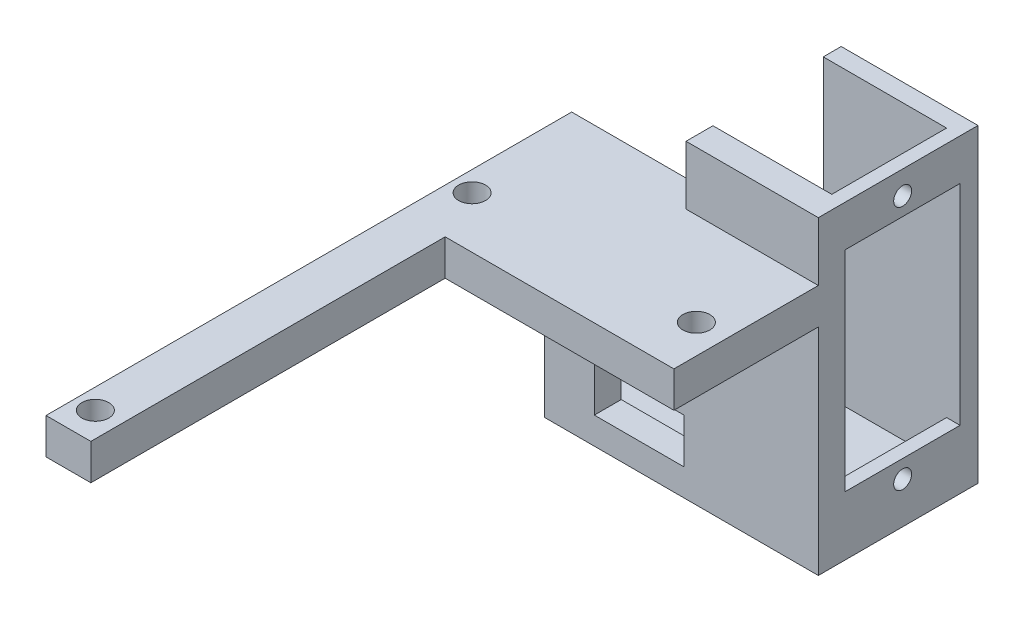
ISO-10303-21;
HEADER;
FILE_DESCRIPTION(('STEP AP214'),'2;1');
FILE_NAME('part.step','',(''),(''),'','','');
FILE_SCHEMA(('AUTOMOTIVE_DESIGN { 1 0 10303 214 1 1 1 1 }'));
ENDSEC;
DATA;
#1=APPLICATION_CONTEXT('core data for automotive mechanical design processes');
#2=APPLICATION_PROTOCOL_DEFINITION('international standard','automotive_design',2000,#1);
#3=PRODUCT_CONTEXT('',#1,'mechanical');
#4=PRODUCT('Part','Part','',(#3));
#5=PRODUCT_RELATED_PRODUCT_CATEGORY('part','',(#4));
#6=PRODUCT_DEFINITION_FORMATION('','',#4);
#7=PRODUCT_DEFINITION_CONTEXT('part definition',#1,'design');
#8=PRODUCT_DEFINITION('design','',#6,#7);
#9=PRODUCT_DEFINITION_SHAPE('','',#8);
#10=(LENGTH_UNIT() NAMED_UNIT(*) SI_UNIT(.MILLI.,.METRE.));
#11=(NAMED_UNIT(*) PLANE_ANGLE_UNIT() SI_UNIT($,.RADIAN.));
#12=(NAMED_UNIT(*) SI_UNIT($,.STERADIAN.) SOLID_ANGLE_UNIT());
#13=UNCERTAINTY_MEASURE_WITH_UNIT(LENGTH_MEASURE(1.E-05),#10,'distance_accuracy_value','');
#14=(GEOMETRIC_REPRESENTATION_CONTEXT(3) GLOBAL_UNCERTAINTY_ASSIGNED_CONTEXT((#13)) GLOBAL_UNIT_ASSIGNED_CONTEXT((#10,
#11,#12)) REPRESENTATION_CONTEXT('',''));
#15=CARTESIAN_POINT('',(0.,0.,0.));
#16=DIRECTION('',(0.,0.,1.));
#17=DIRECTION('',(1.,0.,0.));
#18=AXIS2_PLACEMENT_3D('',#15,#16,#17);
#19=CARTESIAN_POINT('',(0.,4.,0.));
#20=DIRECTION('',(0.,1.,0.));
#21=DIRECTION('',(0.,0.,1.));
#22=AXIS2_PLACEMENT_3D('',#19,#20,#21);
#23=PLANE('',#22);
#24=CARTESIAN_POINT('',(-38.984375,4.,29.3515625));
#25=DIRECTION('',(0.,1.,0.));
#26=DIRECTION('',(0.,0.,1.));
#27=AXIS2_PLACEMENT_3D('',#24,#25,#26);
#28=CIRCLE('',#27,1.5);
#29=CARTESIAN_POINT('',(-38.984375,4.,30.8515625));
#30=VERTEX_POINT('',#29);
#31=EDGE_CURVE('E476',#30,#30,#28,.T.);
#32=ORIENTED_EDGE('',*,*,#31,.F.);
#33=EDGE_LOOP('',(#32));
#34=FACE_BOUND('',#33,.T.);
#35=CARTESIAN_POINT('',(-38.984375,4.,-12.6484375));
#36=DIRECTION('',(0.,1.,0.));
#37=DIRECTION('',(0.,0.,1.));
#38=AXIS2_PLACEMENT_3D('',#35,#36,#37);
#39=CIRCLE('',#38,1.5);
#40=CARTESIAN_POINT('',(-38.984375,4.,-11.1484375));
#41=VERTEX_POINT('',#40);
#42=EDGE_CURVE('E484',#41,#41,#39,.T.);
#43=ORIENTED_EDGE('',*,*,#42,.F.);
#44=EDGE_LOOP('',(#43));
#45=FACE_BOUND('',#44,.T.);
#46=CARTESIAN_POINT('',(-13.984375,4.,-12.6484375));
#47=DIRECTION('',(0.,1.,0.));
#48=DIRECTION('',(0.,0.,1.));
#49=AXIS2_PLACEMENT_3D('',#46,#47,#48);
#50=CIRCLE('',#49,1.5);
#51=CARTESIAN_POINT('',(-13.984375,4.,-11.1484375));
#52=VERTEX_POINT('',#51);
#53=EDGE_CURVE('E470',#52,#52,#50,.T.);
#54=ORIENTED_EDGE('',*,*,#53,.F.);
#55=EDGE_LOOP('',(#54));
#56=FACE_BOUND('',#55,.T.);
#57=DIRECTION('',(-1.,0.,0.));
#58=VECTOR('',#57,1.);
#59=CARTESIAN_POINT('',(-10.734375,4.,-22.9984375));
#60=LINE('',#59,#58);
#61=CARTESIAN_POINT('',(-10.734375,4.,-22.9984375));
#62=VERTEX_POINT('',#61);
#63=CARTESIAN_POINT('',(-25.484375,4.,-22.9984375));
#64=VERTEX_POINT('',#63);
#65=EDGE_CURVE('E85',#62,#64,#60,.T.);
#66=ORIENTED_EDGE('',*,*,#65,.T.);
#67=DIRECTION('',(0.,0.,1.));
#68=VECTOR('',#67,1.);
#69=CARTESIAN_POINT('',(-25.484375,4.,-25.9984375));
#70=LINE('',#69,#68);
#71=CARTESIAN_POINT('',(-25.484375,4.,-25.9984375));
#72=VERTEX_POINT('',#71);
#73=EDGE_CURVE('E262',#72,#64,#70,.T.);
#74=ORIENTED_EDGE('',*,*,#73,.F.);
#75=DIRECTION('',(1.,0.,0.));
#76=VECTOR('',#75,1.);
#77=CARTESIAN_POINT('',(-41.234375,4.,-25.9984375));
#78=LINE('',#77,#76);
#79=CARTESIAN_POINT('',(-41.234375,4.,-25.9984375));
#80=VERTEX_POINT('',#79);
#81=EDGE_CURVE('E466',#80,#72,#78,.T.);
#82=ORIENTED_EDGE('',*,*,#81,.F.);
#83=DIRECTION('',(0.,0.,1.));
#84=VECTOR('',#83,1.);
#85=CARTESIAN_POINT('',(-41.234375,4.,-20.8984375));
#86=LINE('',#85,#84);
#87=CARTESIAN_POINT('',(-41.234375,4.,32.6015625));
#88=VERTEX_POINT('',#87);
#89=EDGE_CURVE('E521',#80,#88,#86,.T.);
#90=ORIENTED_EDGE('',*,*,#89,.T.);
#91=DIRECTION('',(1.,0.,0.));
#92=VECTOR('',#91,1.);
#93=CARTESIAN_POINT('',(-41.234375,4.,32.6015625));
#94=LINE('',#93,#92);
#95=CARTESIAN_POINT('',(-36.234375,4.,32.6015625));
#96=VERTEX_POINT('',#95);
#97=EDGE_CURVE('E513',#88,#96,#94,.T.);
#98=ORIENTED_EDGE('',*,*,#97,.T.);
#99=DIRECTION('',(0.,0.,1.));
#100=VECTOR('',#99,1.);
#101=CARTESIAN_POINT('',(-36.234375,4.,-20.8984375));
#102=LINE('',#101,#100);
#103=CARTESIAN_POINT('',(-36.234375,4.,-6.8984375));
#104=VERTEX_POINT('',#103);
#105=EDGE_CURVE('E517',#104,#96,#102,.T.);
#106=ORIENTED_EDGE('',*,*,#105,.F.);
#107=DIRECTION('',(1.,0.,0.));
#108=VECTOR('',#107,1.);
#109=CARTESIAN_POINT('',(0.,4.,-6.8984375));
#110=LINE('',#109,#108);
#111=CARTESIAN_POINT('',(-10.734375,4.,-6.8984375));
#112=VERTEX_POINT('',#111);
#113=EDGE_CURVE('E498',#104,#112,#110,.T.);
#114=ORIENTED_EDGE('',*,*,#113,.T.);
#115=DIRECTION('',(0.,0.,1.));
#116=VECTOR('',#115,1.);
#117=CARTESIAN_POINT('',(-10.734375,4.,0.));
#118=LINE('',#117,#116);
#119=EDGE_CURVE('E495',#62,#112,#118,.T.);
#120=ORIENTED_EDGE('',*,*,#119,.F.);
#121=EDGE_LOOP('',(#66,#74,#82,#90,#98,#106,#114,#120));
#122=FACE_BOUND('',#121,.T.);
#123=ADVANCED_FACE('F67',(#34,#45,#56,#122),#23,.T.);
#124=CARTESIAN_POINT('',(0.,-5.2,0.));
#125=DIRECTION('',(0.,1.,0.));
#126=DIRECTION('',(0.,0.,1.));
#127=AXIS2_PLACEMENT_3D('',#124,#125,#126);
#128=PLANE('',#127);
#129=DIRECTION('',(1.,0.,0.));
#130=VECTOR('',#129,1.);
#131=CARTESIAN_POINT('',(-41.234375,-5.2,-38.7984375));
#132=LINE('',#131,#130);
#133=CARTESIAN_POINT('',(-41.234375,-5.2,-38.7984375));
#134=VERTEX_POINT('',#133);
#135=CARTESIAN_POINT('',(-25.984375,-5.2,-38.7984375));
#136=VERTEX_POINT('',#135);
#137=EDGE_CURVE('E404',#134,#136,#132,.T.);
#138=ORIENTED_EDGE('',*,*,#137,.T.);
#139=DIRECTION('',(0.,0.,1.));
#140=VECTOR('',#139,1.);
#141=CARTESIAN_POINT('',(-25.984375,-5.2,-40.7984375));
#142=LINE('',#141,#140);
#143=CARTESIAN_POINT('',(-25.984375,-5.2,-40.7984375));
#144=VERTEX_POINT('',#143);
#145=EDGE_CURVE('E248',#144,#136,#142,.T.);
#146=ORIENTED_EDGE('',*,*,#145,.F.);
#147=DIRECTION('',(-1.,0.,0.));
#148=VECTOR('',#147,1.);
#149=CARTESIAN_POINT('',(-41.234375,-5.2,-40.7984375));
#150=LINE('',#149,#148);
#151=CARTESIAN_POINT('',(-41.234375,-5.2,-40.7984375));
#152=VERTEX_POINT('',#151);
#153=EDGE_CURVE('E407',#144,#152,#150,.T.);
#154=ORIENTED_EDGE('',*,*,#153,.T.);
#155=DIRECTION('',(0.,0.,1.));
#156=VECTOR('',#155,1.);
#157=CARTESIAN_POINT('',(-41.234375,-5.2,-40.7984375));
#158=LINE('',#157,#156);
#159=EDGE_CURVE('E400',#152,#134,#158,.T.);
#160=ORIENTED_EDGE('',*,*,#159,.T.);
#161=EDGE_LOOP('',(#138,#146,#154,#160));
#162=FACE_BOUND('',#161,.T.);
#163=ADVANCED_FACE('F563',(#162),#128,.T.);
#164=CARTESIAN_POINT('',(-10.734375,-22.,-40.7984375));
#165=DIRECTION('',(0.,1.,0.));
#166=DIRECTION('',(0.,0.,1.));
#167=AXIS2_PLACEMENT_3D('',#164,#165,#166);
#168=PLANE('',#167);
#169=DIRECTION('',(-1.,0.,0.));
#170=VECTOR('',#169,1.);
#171=CARTESIAN_POINT('',(-10.734375,-22.,-25.9984375));
#172=LINE('',#171,#170);
#173=CARTESIAN_POINT('',(-12.234375,-22.,-25.9984375));
#174=VERTEX_POINT('',#173);
#175=CARTESIAN_POINT('',(-41.234375,-22.,-25.9984375));
#176=VERTEX_POINT('',#175);
#177=EDGE_CURVE('E420',#174,#176,#172,.T.);
#178=ORIENTED_EDGE('',*,*,#177,.F.);
#179=DIRECTION('',(0.,0.,1.));
#180=VECTOR('',#179,1.);
#181=CARTESIAN_POINT('',(-12.234375,-22.,-25.9984375));
#182=LINE('',#181,#180);
#183=CARTESIAN_POINT('',(-12.234375,-22.,-38.7984375));
#184=VERTEX_POINT('',#183);
#185=EDGE_CURVE('E376',#184,#174,#182,.T.);
#186=ORIENTED_EDGE('',*,*,#185,.F.);
#187=DIRECTION('',(1.,0.,0.));
#188=VECTOR('',#187,1.);
#189=CARTESIAN_POINT('',(-41.234375,-22.,-38.7984375));
#190=LINE('',#189,#188);
#191=CARTESIAN_POINT('',(-41.234375,-22.,-38.7984375));
#192=VERTEX_POINT('',#191);
#193=EDGE_CURVE('E399',#192,#184,#190,.T.);
#194=ORIENTED_EDGE('',*,*,#193,.F.);
#195=DIRECTION('',(0.,0.,1.));
#196=VECTOR('',#195,1.);
#197=CARTESIAN_POINT('',(-41.234375,-22.,-40.7984375));
#198=LINE('',#197,#196);
#199=EDGE_CURVE('E431',#192,#176,#198,.T.);
#200=ORIENTED_EDGE('',*,*,#199,.T.);
#201=EDGE_LOOP('',(#178,#186,#194,#200));
#202=FACE_BOUND('',#201,.T.);
#203=ADVANCED_FACE('F569',(#202),#168,.T.);
#204=CARTESIAN_POINT('',(0.,0.,-25.9984375));
#205=DIRECTION('',(0.,0.,-1.));
#206=DIRECTION('',(-1.,0.,0.));
#207=AXIS2_PLACEMENT_3D('',#204,#205,#206);
#208=PLANE('',#207);
#209=DIRECTION('',(0.,-1.,0.));
#210=VECTOR('',#209,1.);
#211=CARTESIAN_POINT('',(-35.7067529166508,-16.,-25.9984375));
#212=LINE('',#211,#210);
#213=CARTESIAN_POINT('',(-35.7067529166508,-16.,-25.9984375));
#214=VERTEX_POINT('',#213);
#215=CARTESIAN_POINT('',(-35.7067529166508,-21.,-25.9984375));
#216=VERTEX_POINT('',#215);
#217=EDGE_CURVE('E314',#214,#216,#212,.T.);
#218=ORIENTED_EDGE('',*,*,#217,.T.);
#219=DIRECTION('',(1.,0.,0.));
#220=VECTOR('',#219,1.);
#221=CARTESIAN_POINT('',(-35.7067529166508,-21.,-25.9984375));
#222=LINE('',#221,#220);
#223=CARTESIAN_POINT('',(-25.7067529166508,-21.,-25.9984375));
#224=VERTEX_POINT('',#223);
#225=EDGE_CURVE('E318',#216,#224,#222,.T.);
#226=ORIENTED_EDGE('',*,*,#225,.T.);
#227=DIRECTION('',(0.,1.,0.));
#228=VECTOR('',#227,1.);
#229=CARTESIAN_POINT('',(-25.7067529166508,-16.,-25.9984375));
#230=LINE('',#229,#228);
#231=CARTESIAN_POINT('',(-25.7067529166508,-16.,-25.9984375));
#232=VERTEX_POINT('',#231);
#233=EDGE_CURVE('E93',#224,#232,#230,.T.);
#234=ORIENTED_EDGE('',*,*,#233,.T.);
#235=DIRECTION('',(-1.,0.,0.));
#236=VECTOR('',#235,1.);
#237=CARTESIAN_POINT('',(-35.7067529166508,-16.,-25.9984375));
#238=LINE('',#237,#236);
#239=EDGE_CURVE('E325',#232,#214,#238,.T.);
#240=ORIENTED_EDGE('',*,*,#239,.T.);
#241=EDGE_LOOP('',(#218,#226,#234,#240));
#242=FACE_BOUND('',#241,.T.);
#243=DIRECTION('',(1.,0.,0.));
#244=VECTOR('',#243,1.);
#245=CARTESIAN_POINT('',(-10.734375,-17.4,-25.9984375));
#246=LINE('',#245,#244);
#247=CARTESIAN_POINT('',(-12.234375,-17.4,-25.9984375));
#248=VERTEX_POINT('',#247);
#249=CARTESIAN_POINT('',(-10.734375,-17.4,-25.9984375));
#250=VERTEX_POINT('',#249);
#251=EDGE_CURVE('E387',#248,#250,#246,.T.);
#252=ORIENTED_EDGE('',*,*,#251,.F.);
#253=DIRECTION('',(0.,-1.,0.));
#254=VECTOR('',#253,1.);
#255=CARTESIAN_POINT('',(-12.234375,-17.4,-25.9984375));
#256=LINE('',#255,#254);
#257=EDGE_CURVE('E390',#248,#174,#256,.T.);
#258=ORIENTED_EDGE('',*,*,#257,.T.);
#259=ORIENTED_EDGE('',*,*,#177,.T.);
#260=DIRECTION('',(0.,1.,0.));
#261=VECTOR('',#260,1.);
#262=CARTESIAN_POINT('',(-41.234375,0.,-25.9984375));
#263=LINE('',#262,#261);
#264=EDGE_CURVE('E463',#176,#80,#263,.T.);
#265=ORIENTED_EDGE('',*,*,#264,.T.);
#266=ORIENTED_EDGE('',*,*,#81,.T.);
#267=DIRECTION('',(0.,-1.,0.));
#268=VECTOR('',#267,1.);
#269=CARTESIAN_POINT('',(-25.484375,10.55,-25.9984375));
#270=LINE('',#269,#268);
#271=CARTESIAN_POINT('',(-25.484375,10.55,-25.9984375));
#272=VERTEX_POINT('',#271);
#273=EDGE_CURVE('E274',#272,#72,#270,.T.);
#274=ORIENTED_EDGE('',*,*,#273,.F.);
#275=DIRECTION('',(-1.,0.,0.));
#276=VECTOR('',#275,1.);
#277=CARTESIAN_POINT('',(-10.734375,10.55,-25.9984375));
#278=LINE('',#277,#276);
#279=CARTESIAN_POINT('',(-12.234375,10.55,-25.9984375));
#280=VERTEX_POINT('',#279);
#281=EDGE_CURVE('E255',#280,#272,#278,.T.);
#282=ORIENTED_EDGE('',*,*,#281,.F.);
#283=DIRECTION('',(0.,1.,0.));
#284=VECTOR('',#283,1.);
#285=CARTESIAN_POINT('',(-12.234375,5.95,-25.9984375));
#286=LINE('',#285,#284);
#287=CARTESIAN_POINT('',(-12.234375,5.95,-25.9984375));
#288=VERTEX_POINT('',#287);
#289=EDGE_CURVE('E306',#288,#280,#286,.T.);
#290=ORIENTED_EDGE('',*,*,#289,.F.);
#291=DIRECTION('',(1.,0.,0.));
#292=VECTOR('',#291,1.);
#293=CARTESIAN_POINT('',(-10.734375,5.95,-25.9984375));
#294=LINE('',#293,#292);
#295=CARTESIAN_POINT('',(-10.734375,5.95,-25.9984375));
#296=VERTEX_POINT('',#295);
#297=EDGE_CURVE('E286',#288,#296,#294,.T.);
#298=ORIENTED_EDGE('',*,*,#297,.T.);
#299=DIRECTION('',(0.,-1.,0.));
#300=VECTOR('',#299,1.);
#301=CARTESIAN_POINT('',(-10.734375,4.,-25.9984375));
#302=LINE('',#301,#300);
#303=EDGE_CURVE('E459',#296,#250,#302,.T.);
#304=ORIENTED_EDGE('',*,*,#303,.T.);
#305=EDGE_LOOP('',(#252,#258,#259,#265,#266,#274,#282,#290,#298,#304));
#306=FACE_BOUND('',#305,.T.);
#307=ADVANCED_FACE('F618',(#242,#306),#208,.T.);
#308=CARTESIAN_POINT('',(-41.234375,-5.2,-38.7984375));
#309=DIRECTION('',(0.,0.,-1.));
#310=DIRECTION('',(-1.,0.,0.));
#311=AXIS2_PLACEMENT_3D('',#308,#309,#310);
#312=PLANE('',#311);
#313=DIRECTION('',(-1.,0.,0.));
#314=VECTOR('',#313,1.);
#315=CARTESIAN_POINT('',(-10.734375,5.95,-38.7984375));
#316=LINE('',#315,#314);
#317=CARTESIAN_POINT('',(-10.734375,5.95,-38.7984375));
#318=VERTEX_POINT('',#317);
#319=CARTESIAN_POINT('',(-12.234375,5.95,-38.7984375));
#320=VERTEX_POINT('',#319);
#321=EDGE_CURVE('E295',#318,#320,#316,.T.);
#322=ORIENTED_EDGE('',*,*,#321,.T.);
#323=DIRECTION('',(0.,1.,0.));
#324=VECTOR('',#323,1.);
#325=CARTESIAN_POINT('',(-12.234375,5.95,-38.7984375));
#326=LINE('',#325,#324);
#327=CARTESIAN_POINT('',(-12.234375,10.55,-38.7984375));
#328=VERTEX_POINT('',#327);
#329=EDGE_CURVE('E299',#320,#328,#326,.T.);
#330=ORIENTED_EDGE('',*,*,#329,.T.);
#331=DIRECTION('',(1.,0.,0.));
#332=VECTOR('',#331,1.);
#333=CARTESIAN_POINT('',(-10.734375,10.55,-38.7984375));
#334=LINE('',#333,#332);
#335=CARTESIAN_POINT('',(-25.984375,10.55,-38.7984375));
#336=VERTEX_POINT('',#335);
#337=EDGE_CURVE('E361',#336,#328,#334,.T.);
#338=ORIENTED_EDGE('',*,*,#337,.F.);
#339=DIRECTION('',(0.,-1.,0.));
#340=VECTOR('',#339,1.);
#341=CARTESIAN_POINT('',(-25.984375,10.55,-38.7984375));
#342=LINE('',#341,#340);
#343=EDGE_CURVE('E365',#336,#136,#342,.T.);
#344=ORIENTED_EDGE('',*,*,#343,.T.);
#345=ORIENTED_EDGE('',*,*,#137,.F.);
#346=DIRECTION('',(0.,-1.,0.));
#347=VECTOR('',#346,1.);
#348=CARTESIAN_POINT('',(-41.234375,-5.2,-38.7984375));
#349=LINE('',#348,#347);
#350=EDGE_CURVE('E416',#134,#192,#349,.T.);
#351=ORIENTED_EDGE('',*,*,#350,.T.);
#352=ORIENTED_EDGE('',*,*,#193,.T.);
#353=DIRECTION('',(0.,-1.,0.));
#354=VECTOR('',#353,1.);
#355=CARTESIAN_POINT('',(-12.234375,-17.4,-38.7984375));
#356=LINE('',#355,#354);
#357=CARTESIAN_POINT('',(-12.234375,-17.4,-38.7984375));
#358=VERTEX_POINT('',#357);
#359=EDGE_CURVE('E396',#358,#184,#356,.T.);
#360=ORIENTED_EDGE('',*,*,#359,.F.);
#361=DIRECTION('',(-1.,0.,0.));
#362=VECTOR('',#361,1.);
#363=CARTESIAN_POINT('',(-10.734375,-17.4,-38.7984375));
#364=LINE('',#363,#362);
#365=CARTESIAN_POINT('',(-10.734375,-17.4,-38.7984375));
#366=VERTEX_POINT('',#365);
#367=EDGE_CURVE('E381',#366,#358,#364,.T.);
#368=ORIENTED_EDGE('',*,*,#367,.F.);
#369=DIRECTION('',(0.,-1.,0.));
#370=VECTOR('',#369,1.);
#371=CARTESIAN_POINT('',(-10.734375,-5.2,-38.7984375));
#372=LINE('',#371,#370);
#373=EDGE_CURVE('E410',#318,#366,#372,.T.);
#374=ORIENTED_EDGE('',*,*,#373,.F.);
#375=EDGE_LOOP('',(#322,#330,#338,#344,#345,#351,#352,#360,#368,#374));
#376=FACE_BOUND('',#375,.T.);
#377=ADVANCED_FACE('F581',(#376),#312,.F.);
#378=CARTESIAN_POINT('',(0.,0.,0.));
#379=DIRECTION('',(0.,1.,0.));
#380=DIRECTION('',(0.,0.,1.));
#381=AXIS2_PLACEMENT_3D('',#378,#379,#380);
#382=PLANE('',#381);
#383=CARTESIAN_POINT('',(-13.984375,0.,-12.6484375));
#384=DIRECTION('',(0.,1.,0.));
#385=DIRECTION('',(0.,0.,1.));
#386=AXIS2_PLACEMENT_3D('',#383,#384,#385);
#387=CIRCLE('',#386,1.5);
#388=CARTESIAN_POINT('',(-13.984375,0.,-11.1484375));
#389=VERTEX_POINT('',#388);
#390=EDGE_CURVE('E488',#389,#389,#387,.T.);
#391=ORIENTED_EDGE('',*,*,#390,.T.);
#392=EDGE_LOOP('',(#391));
#393=FACE_BOUND('',#392,.T.);
#394=CARTESIAN_POINT('',(-38.984375,0.,-12.6484375));
#395=DIRECTION('',(0.,1.,0.));
#396=DIRECTION('',(0.,0.,1.));
#397=AXIS2_PLACEMENT_3D('',#394,#395,#396);
#398=CIRCLE('',#397,1.5);
#399=CARTESIAN_POINT('',(-38.984375,0.,-11.1484375));
#400=VERTEX_POINT('',#399);
#401=EDGE_CURVE('E480',#400,#400,#398,.T.);
#402=ORIENTED_EDGE('',*,*,#401,.T.);
#403=EDGE_LOOP('',(#402));
#404=FACE_BOUND('',#403,.T.);
#405=CARTESIAN_POINT('',(-38.984375,0.,29.3515625));
#406=DIRECTION('',(0.,1.,0.));
#407=DIRECTION('',(0.,0.,1.));
#408=AXIS2_PLACEMENT_3D('',#405,#406,#407);
#409=CIRCLE('',#408,1.5);
#410=CARTESIAN_POINT('',(-38.984375,0.,30.8515625));
#411=VERTEX_POINT('',#410);
#412=EDGE_CURVE('E471',#411,#411,#409,.T.);
#413=ORIENTED_EDGE('',*,*,#412,.T.);
#414=EDGE_LOOP('',(#413));
#415=FACE_BOUND('',#414,.T.);
#416=DIRECTION('',(-1.,0.,0.));
#417=VECTOR('',#416,1.);
#418=CARTESIAN_POINT('',(-10.734375,0.,-22.9984375));
#419=LINE('',#418,#417);
#420=CARTESIAN_POINT('',(-10.734375,0.,-22.9984375));
#421=VERTEX_POINT('',#420);
#422=CARTESIAN_POINT('',(-41.234375,0.,-22.9984375));
#423=VERTEX_POINT('',#422);
#424=EDGE_CURVE('E437',#421,#423,#419,.T.);
#425=ORIENTED_EDGE('',*,*,#424,.F.);
#426=DIRECTION('',(0.,0.,1.));
#427=VECTOR('',#426,1.);
#428=CARTESIAN_POINT('',(-10.734375,0.,0.));
#429=LINE('',#428,#427);
#430=CARTESIAN_POINT('',(-10.734375,0.,-6.8984375));
#431=VERTEX_POINT('',#430);
#432=EDGE_CURVE('E503',#421,#431,#429,.T.);
#433=ORIENTED_EDGE('',*,*,#432,.T.);
#434=DIRECTION('',(1.,0.,0.));
#435=VECTOR('',#434,1.);
#436=CARTESIAN_POINT('',(0.,0.,-6.8984375));
#437=LINE('',#436,#435);
#438=CARTESIAN_POINT('',(-36.234375,0.,-6.8984375));
#439=VERTEX_POINT('',#438);
#440=EDGE_CURVE('E499',#439,#431,#437,.T.);
#441=ORIENTED_EDGE('',*,*,#440,.F.);
#442=DIRECTION('',(0.,0.,1.));
#443=VECTOR('',#442,1.);
#444=CARTESIAN_POINT('',(-36.234375,0.,-20.8984375));
#445=LINE('',#444,#443);
#446=CARTESIAN_POINT('',(-36.234375,0.,32.6015625));
#447=VERTEX_POINT('',#446);
#448=EDGE_CURVE('E528',#439,#447,#445,.T.);
#449=ORIENTED_EDGE('',*,*,#448,.T.);
#450=DIRECTION('',(1.,0.,0.));
#451=VECTOR('',#450,1.);
#452=CARTESIAN_POINT('',(-41.234375,0.,32.6015625));
#453=LINE('',#452,#451);
#454=CARTESIAN_POINT('',(-41.234375,0.,32.6015625));
#455=VERTEX_POINT('',#454);
#456=EDGE_CURVE('E475',#455,#447,#453,.T.);
#457=ORIENTED_EDGE('',*,*,#456,.F.);
#458=DIRECTION('',(0.,0.,1.));
#459=VECTOR('',#458,1.);
#460=CARTESIAN_POINT('',(-41.234375,0.,-20.8984375));
#461=LINE('',#460,#459);
#462=EDGE_CURVE('E518',#423,#455,#461,.T.);
#463=ORIENTED_EDGE('',*,*,#462,.F.);
#464=EDGE_LOOP('',(#425,#433,#441,#449,#457,#463));
#465=FACE_BOUND('',#464,.T.);
#466=ADVANCED_FACE('F578',(#393,#404,#415,#465),#382,.F.);
#467=CARTESIAN_POINT('',(-10.734375,4.,0.));
#468=DIRECTION('',(1.,0.,0.));
#469=DIRECTION('',(0.,0.,-1.));
#470=AXIS2_PLACEMENT_3D('',#467,#468,#469);
#471=PLANE('',#470);
#472=DIRECTION('',(0.,-1.,0.));
#473=VECTOR('',#472,1.);
#474=CARTESIAN_POINT('',(-10.734375,10.55,-22.9984375));
#475=LINE('',#474,#473);
#476=CARTESIAN_POINT('',(-10.734375,10.55,-22.9984375));
#477=VERTEX_POINT('',#476);
#478=EDGE_CURVE('E239',#477,#62,#475,.T.);
#479=ORIENTED_EDGE('',*,*,#478,.T.);
#480=ORIENTED_EDGE('',*,*,#119,.T.);
#481=DIRECTION('',(0.,-1.,0.));
#482=VECTOR('',#481,1.);
#483=CARTESIAN_POINT('',(-10.734375,4.,-6.8984375));
#484=LINE('',#483,#482);
#485=EDGE_CURVE('E77',#112,#431,#484,.T.);
#486=ORIENTED_EDGE('',*,*,#485,.T.);
#487=ORIENTED_EDGE('',*,*,#432,.F.);
#488=DIRECTION('',(0.,1.,0.));
#489=VECTOR('',#488,1.);
#490=CARTESIAN_POINT('',(-10.734375,-24.,-22.9984375));
#491=LINE('',#490,#489);
#492=CARTESIAN_POINT('',(-10.734375,-24.,-22.9984375));
#493=VERTEX_POINT('',#492);
#494=EDGE_CURVE('E455',#493,#421,#491,.T.);
#495=ORIENTED_EDGE('',*,*,#494,.F.);
#496=DIRECTION('',(0.,0.,1.));
#497=VECTOR('',#496,1.);
#498=CARTESIAN_POINT('',(-10.734375,-24.,-25.9984375));
#499=LINE('',#498,#497);
#500=CARTESIAN_POINT('',(-10.734375,-24.,-40.7984375));
#501=VERTEX_POINT('',#500);
#502=EDGE_CURVE('E438',#501,#493,#499,.T.);
#503=ORIENTED_EDGE('',*,*,#502,.F.);
#504=DIRECTION('',(0.,-1.,0.));
#505=VECTOR('',#504,1.);
#506=CARTESIAN_POINT('',(-10.734375,-22.,-40.7984375));
#507=LINE('',#506,#505);
#508=CARTESIAN_POINT('',(-10.734375,10.55,-40.7984375));
#509=VERTEX_POINT('',#508);
#510=EDGE_CURVE('E242',#509,#501,#507,.T.);
#511=ORIENTED_EDGE('',*,*,#510,.F.);
#512=DIRECTION('',(0.,0.,-1.));
#513=VECTOR('',#512,1.);
#514=CARTESIAN_POINT('',(-10.734375,10.55,-40.7984375));
#515=LINE('',#514,#513);
#516=EDGE_CURVE('E236',#477,#509,#515,.T.);
#517=ORIENTED_EDGE('',*,*,#516,.F.);
#518=EDGE_LOOP('',(#479,#480,#486,#487,#495,#503,#511,#517));
#519=FACE_BOUND('',#518,.T.);
#520=CARTESIAN_POINT('',(-10.734375,7.95000000000001,-32.3984375));
#521=DIRECTION('',(-1.,0.,0.));
#522=DIRECTION('',(0.,0.,-1.));
#523=AXIS2_PLACEMENT_3D('',#520,#521,#522);
#524=CIRCLE('',#523,0.999999999999998);
#525=CARTESIAN_POINT('',(-10.734375,7.95000000000001,-33.3984375));
#526=VERTEX_POINT('',#525);
#527=EDGE_CURVE('E277',#526,#526,#524,.T.);
#528=ORIENTED_EDGE('',*,*,#527,.T.);
#529=EDGE_LOOP('',(#528));
#530=FACE_BOUND('',#529,.T.);
#531=CARTESIAN_POINT('',(-10.734375,-19.4,-32.3984375));
#532=DIRECTION('',(1.,0.,0.));
#533=DIRECTION('',(0.,0.,-1.));
#534=AXIS2_PLACEMENT_3D('',#531,#532,#533);
#535=CIRCLE('',#534,0.999999999999998);
#536=CARTESIAN_POINT('',(-10.734375,-19.4,-33.3984375));
#537=VERTEX_POINT('',#536);
#538=EDGE_CURVE('E309',#537,#537,#535,.T.);
#539=ORIENTED_EDGE('',*,*,#538,.F.);
#540=EDGE_LOOP('',(#539));
#541=FACE_BOUND('',#540,.T.);
#542=DIRECTION('',(0.,0.,-1.));
#543=VECTOR('',#542,1.);
#544=CARTESIAN_POINT('',(-10.734375,-17.4,-25.9984375));
#545=LINE('',#544,#543);
#546=EDGE_CURVE('E377',#250,#366,#545,.T.);
#547=ORIENTED_EDGE('',*,*,#546,.F.);
#548=ORIENTED_EDGE('',*,*,#303,.F.);
#549=DIRECTION('',(0.,0.,-1.));
#550=VECTOR('',#549,1.);
#551=CARTESIAN_POINT('',(-10.734375,5.95,-25.9984375));
#552=LINE('',#551,#550);
#553=EDGE_CURVE('E283',#296,#318,#552,.T.);
#554=ORIENTED_EDGE('',*,*,#553,.T.);
#555=ORIENTED_EDGE('',*,*,#373,.T.);
#556=EDGE_LOOP('',(#547,#548,#554,#555));
#557=FACE_BOUND('',#556,.T.);
#558=ADVANCED_FACE('F237',(#519,#530,#541,#557),#471,.T.);
#559=CARTESIAN_POINT('',(0.,4.,-6.8984375));
#560=DIRECTION('',(0.,0.,-1.));
#561=DIRECTION('',(-1.,0.,0.));
#562=AXIS2_PLACEMENT_3D('',#559,#560,#561);
#563=PLANE('',#562);
#564=ORIENTED_EDGE('',*,*,#440,.T.);
#565=ORIENTED_EDGE('',*,*,#485,.F.);
#566=ORIENTED_EDGE('',*,*,#113,.F.);
#567=DIRECTION('',(0.,-1.,0.));
#568=VECTOR('',#567,1.);
#569=CARTESIAN_POINT('',(-36.234375,4.,-6.8984375));
#570=LINE('',#569,#568);
#571=EDGE_CURVE('E12',#104,#439,#570,.T.);
#572=ORIENTED_EDGE('',*,*,#571,.T.);
#573=EDGE_LOOP('',(#564,#565,#566,#572));
#574=FACE_BOUND('',#573,.T.);
#575=ADVANCED_FACE('F583',(#574),#563,.F.);
#576=CARTESIAN_POINT('',(-41.234375,4.,-20.8984375));
#577=DIRECTION('',(1.,0.,0.));
#578=DIRECTION('',(0.,0.,-1.));
#579=AXIS2_PLACEMENT_3D('',#576,#577,#578);
#580=PLANE('',#579);
#581=ORIENTED_EDGE('',*,*,#264,.F.);
#582=ORIENTED_EDGE('',*,*,#199,.F.);
#583=ORIENTED_EDGE('',*,*,#350,.F.);
#584=ORIENTED_EDGE('',*,*,#159,.F.);
#585=DIRECTION('',(0.,-1.,0.));
#586=VECTOR('',#585,1.);
#587=CARTESIAN_POINT('',(-41.234375,-22.,-40.7984375));
#588=LINE('',#587,#586);
#589=CARTESIAN_POINT('',(-41.234375,-24.,-40.7984375));
#590=VERTEX_POINT('',#589);
#591=EDGE_CURVE('E427',#152,#590,#588,.T.);
#592=ORIENTED_EDGE('',*,*,#591,.T.);
#593=DIRECTION('',(0.,0.,-1.));
#594=VECTOR('',#593,1.);
#595=CARTESIAN_POINT('',(-41.234375,-24.,-25.9984375));
#596=LINE('',#595,#594);
#597=CARTESIAN_POINT('',(-41.234375,-24.,-22.9984375));
#598=VERTEX_POINT('',#597);
#599=EDGE_CURVE('E445',#598,#590,#596,.T.);
#600=ORIENTED_EDGE('',*,*,#599,.F.);
#601=DIRECTION('',(0.,1.,0.));
#602=VECTOR('',#601,1.);
#603=CARTESIAN_POINT('',(-41.234375,-24.,-22.9984375));
#604=LINE('',#603,#602);
#605=EDGE_CURVE('E448',#598,#423,#604,.T.);
#606=ORIENTED_EDGE('',*,*,#605,.T.);
#607=ORIENTED_EDGE('',*,*,#462,.T.);
#608=DIRECTION('',(0.,-1.,0.));
#609=VECTOR('',#608,1.);
#610=CARTESIAN_POINT('',(-41.234375,4.,32.6015625));
#611=LINE('',#610,#609);
#612=EDGE_CURVE('E524',#88,#455,#611,.T.);
#613=ORIENTED_EDGE('',*,*,#612,.F.);
#614=ORIENTED_EDGE('',*,*,#89,.F.);
#615=EDGE_LOOP('',(#581,#582,#583,#584,#592,#600,#606,#607,#613,#614));
#616=FACE_BOUND('',#615,.T.);
#617=ADVANCED_FACE('F586',(#616),#580,.F.);
#618=CARTESIAN_POINT('',(-41.234375,4.,32.6015625));
#619=DIRECTION('',(0.,0.,-1.));
#620=DIRECTION('',(-1.,0.,0.));
#621=AXIS2_PLACEMENT_3D('',#618,#619,#620);
#622=PLANE('',#621);
#623=ORIENTED_EDGE('',*,*,#456,.T.);
#624=DIRECTION('',(0.,-1.,0.));
#625=VECTOR('',#624,1.);
#626=CARTESIAN_POINT('',(-36.234375,4.,32.6015625));
#627=LINE('',#626,#625);
#628=EDGE_CURVE('E506',#96,#447,#627,.T.);
#629=ORIENTED_EDGE('',*,*,#628,.F.);
#630=ORIENTED_EDGE('',*,*,#97,.F.);
#631=ORIENTED_EDGE('',*,*,#612,.T.);
#632=EDGE_LOOP('',(#623,#629,#630,#631));
#633=FACE_BOUND('',#632,.T.);
#634=ADVANCED_FACE('F69',(#633),#622,.F.);
#635=CARTESIAN_POINT('',(-36.234375,4.,-20.8984375));
#636=DIRECTION('',(1.,0.,0.));
#637=DIRECTION('',(0.,0.,-1.));
#638=AXIS2_PLACEMENT_3D('',#635,#636,#637);
#639=PLANE('',#638);
#640=ORIENTED_EDGE('',*,*,#571,.F.);
#641=ORIENTED_EDGE('',*,*,#105,.T.);
#642=ORIENTED_EDGE('',*,*,#628,.T.);
#643=ORIENTED_EDGE('',*,*,#448,.F.);
#644=EDGE_LOOP('',(#640,#641,#642,#643));
#645=FACE_BOUND('',#644,.T.);
#646=ADVANCED_FACE('F588',(#645),#639,.T.);
#647=CARTESIAN_POINT('',(-13.984375,0.,-12.6484375));
#648=DIRECTION('',(0.,1.,0.));
#649=DIRECTION('',(0.,0.,1.));
#650=AXIS2_PLACEMENT_3D('',#647,#648,#649);
#651=CYLINDRICAL_SURFACE('',#650,1.5);
#652=ORIENTED_EDGE('',*,*,#390,.F.);
#653=EDGE_LOOP('',(#652));
#654=FACE_BOUND('',#653,.T.);
#655=ORIENTED_EDGE('',*,*,#53,.T.);
#656=EDGE_LOOP('',(#655));
#657=FACE_BOUND('',#656,.T.);
#658=ADVANCED_FACE('F576',(#654,#657),#651,.F.);
#659=CARTESIAN_POINT('',(-38.984375,0.,-12.6484375));
#660=DIRECTION('',(0.,1.,0.));
#661=DIRECTION('',(0.,0.,1.));
#662=AXIS2_PLACEMENT_3D('',#659,#660,#661);
#663=CYLINDRICAL_SURFACE('',#662,1.5);
#664=ORIENTED_EDGE('',*,*,#401,.F.);
#665=EDGE_LOOP('',(#664));
#666=FACE_BOUND('',#665,.T.);
#667=ORIENTED_EDGE('',*,*,#42,.T.);
#668=EDGE_LOOP('',(#667));
#669=FACE_BOUND('',#668,.T.);
#670=ADVANCED_FACE('F599',(#666,#669),#663,.F.);
#671=CARTESIAN_POINT('',(-38.984375,0.,29.3515625));
#672=DIRECTION('',(0.,1.,0.));
#673=DIRECTION('',(0.,0.,1.));
#674=AXIS2_PLACEMENT_3D('',#671,#672,#673);
#675=CYLINDRICAL_SURFACE('',#674,1.5);
#676=ORIENTED_EDGE('',*,*,#412,.F.);
#677=EDGE_LOOP('',(#676));
#678=FACE_BOUND('',#677,.T.);
#679=ORIENTED_EDGE('',*,*,#31,.T.);
#680=EDGE_LOOP('',(#679));
#681=FACE_BOUND('',#680,.T.);
#682=ADVANCED_FACE('F677',(#678,#681),#675,.F.);
#683=CARTESIAN_POINT('',(-10.734375,-24.,-22.9984375));
#684=DIRECTION('',(0.,0.,-1.));
#685=DIRECTION('',(-1.,0.,0.));
#686=AXIS2_PLACEMENT_3D('',#683,#684,#685);
#687=PLANE('',#686);
#688=DIRECTION('',(1.,0.,0.));
#689=VECTOR('',#688,1.);
#690=CARTESIAN_POINT('',(-35.7067529166508,-21.,-22.9984375));
#691=LINE('',#690,#689);
#692=CARTESIAN_POINT('',(-35.7067529166508,-21.,-22.9984375));
#693=VERTEX_POINT('',#692);
#694=CARTESIAN_POINT('',(-25.7067529166508,-21.,-22.9984375));
#695=VERTEX_POINT('',#694);
#696=EDGE_CURVE('E333',#693,#695,#691,.T.);
#697=ORIENTED_EDGE('',*,*,#696,.F.);
#698=DIRECTION('',(0.,-1.,0.));
#699=VECTOR('',#698,1.);
#700=CARTESIAN_POINT('',(-35.7067529166508,-16.,-22.9984375));
#701=LINE('',#700,#699);
#702=CARTESIAN_POINT('',(-35.7067529166508,-16.,-22.9984375));
#703=VERTEX_POINT('',#702);
#704=EDGE_CURVE('E330',#703,#693,#701,.T.);
#705=ORIENTED_EDGE('',*,*,#704,.F.);
#706=DIRECTION('',(-1.,0.,0.));
#707=VECTOR('',#706,1.);
#708=CARTESIAN_POINT('',(-35.7067529166508,-16.,-22.9984375));
#709=LINE('',#708,#707);
#710=CARTESIAN_POINT('',(-25.7067529166508,-16.,-22.9984375));
#711=VERTEX_POINT('',#710);
#712=EDGE_CURVE('E319',#711,#703,#709,.T.);
#713=ORIENTED_EDGE('',*,*,#712,.F.);
#714=DIRECTION('',(0.,1.,0.));
#715=VECTOR('',#714,1.);
#716=CARTESIAN_POINT('',(-25.7067529166508,-16.,-22.9984375));
#717=LINE('',#716,#715);
#718=EDGE_CURVE('E337',#695,#711,#717,.T.);
#719=ORIENTED_EDGE('',*,*,#718,.F.);
#720=EDGE_LOOP('',(#697,#705,#713,#719));
#721=FACE_BOUND('',#720,.T.);
#722=ORIENTED_EDGE('',*,*,#424,.T.);
#723=ORIENTED_EDGE('',*,*,#605,.F.);
#724=DIRECTION('',(-1.,0.,0.));
#725=VECTOR('',#724,1.);
#726=CARTESIAN_POINT('',(-10.734375,-24.,-22.9984375));
#727=LINE('',#726,#725);
#728=EDGE_CURVE('E442',#493,#598,#727,.T.);
#729=ORIENTED_EDGE('',*,*,#728,.F.);
#730=ORIENTED_EDGE('',*,*,#494,.T.);
#731=EDGE_LOOP('',(#722,#723,#729,#730));
#732=FACE_BOUND('',#731,.T.);
#733=ADVANCED_FACE('F629',(#721,#732),#687,.F.);
#734=CARTESIAN_POINT('',(0.,-24.,0.));
#735=DIRECTION('',(0.,-1.,0.));
#736=DIRECTION('',(0.,0.,-1.));
#737=AXIS2_PLACEMENT_3D('',#734,#735,#736);
#738=PLANE('',#737);
#739=ORIENTED_EDGE('',*,*,#502,.T.);
#740=ORIENTED_EDGE('',*,*,#728,.T.);
#741=ORIENTED_EDGE('',*,*,#599,.T.);
#742=DIRECTION('',(-1.,0.,0.));
#743=VECTOR('',#742,1.);
#744=CARTESIAN_POINT('',(-10.734375,-24.,-40.7984375));
#745=LINE('',#744,#743);
#746=EDGE_CURVE('E423',#501,#590,#745,.T.);
#747=ORIENTED_EDGE('',*,*,#746,.F.);
#748=EDGE_LOOP('',(#739,#740,#741,#747));
#749=FACE_BOUND('',#748,.T.);
#750=ADVANCED_FACE('F635',(#749),#738,.T.);
#751=CARTESIAN_POINT('',(0.,0.,-40.7984375));
#752=DIRECTION('',(0.,0.,-1.));
#753=DIRECTION('',(-1.,0.,0.));
#754=AXIS2_PLACEMENT_3D('',#751,#752,#753);
#755=PLANE('',#754);
#756=ORIENTED_EDGE('',*,*,#510,.T.);
#757=ORIENTED_EDGE('',*,*,#746,.T.);
#758=ORIENTED_EDGE('',*,*,#591,.F.);
#759=ORIENTED_EDGE('',*,*,#153,.F.);
#760=DIRECTION('',(0.,-1.,0.));
#761=VECTOR('',#760,1.);
#762=CARTESIAN_POINT('',(-25.984375,10.55,-40.7984375));
#763=LINE('',#762,#761);
#764=CARTESIAN_POINT('',(-25.984375,10.55,-40.7984375));
#765=VERTEX_POINT('',#764);
#766=EDGE_CURVE('E372',#765,#144,#763,.T.);
#767=ORIENTED_EDGE('',*,*,#766,.F.);
#768=DIRECTION('',(-1.,0.,0.));
#769=VECTOR('',#768,1.);
#770=CARTESIAN_POINT('',(-10.734375,10.55,-40.7984375));
#771=LINE('',#770,#769);
#772=EDGE_CURVE('E247',#509,#765,#771,.T.);
#773=ORIENTED_EDGE('',*,*,#772,.F.);
#774=EDGE_LOOP('',(#756,#757,#758,#759,#767,#773));
#775=FACE_BOUND('',#774,.T.);
#776=ADVANCED_FACE('F637',(#775),#755,.T.);
#777=CARTESIAN_POINT('',(-12.234375,-17.4,-25.9984375));
#778=DIRECTION('',(1.,0.,0.));
#779=DIRECTION('',(0.,0.,-1.));
#780=AXIS2_PLACEMENT_3D('',#777,#778,#779);
#781=PLANE('',#780);
#782=CARTESIAN_POINT('',(-12.234375,-19.4,-32.3984375));
#783=DIRECTION('',(1.,0.,0.));
#784=DIRECTION('',(0.,0.,-1.));
#785=AXIS2_PLACEMENT_3D('',#782,#783,#784);
#786=CIRCLE('',#785,0.999999999999998);
#787=CARTESIAN_POINT('',(-12.234375,-19.4,-33.3984375));
#788=VERTEX_POINT('',#787);
#789=EDGE_CURVE('E313',#788,#788,#786,.T.);
#790=ORIENTED_EDGE('',*,*,#789,.T.);
#791=EDGE_LOOP('',(#790));
#792=FACE_BOUND('',#791,.T.);
#793=ORIENTED_EDGE('',*,*,#185,.T.);
#794=ORIENTED_EDGE('',*,*,#257,.F.);
#795=DIRECTION('',(0.,0.,1.));
#796=VECTOR('',#795,1.);
#797=CARTESIAN_POINT('',(-12.234375,-17.4,-25.9984375));
#798=LINE('',#797,#796);
#799=EDGE_CURVE('E384',#358,#248,#798,.T.);
#800=ORIENTED_EDGE('',*,*,#799,.F.);
#801=ORIENTED_EDGE('',*,*,#359,.T.);
#802=EDGE_LOOP('',(#793,#794,#800,#801));
#803=FACE_BOUND('',#802,.T.);
#804=ADVANCED_FACE('F542',(#792,#803),#781,.F.);
#805=CARTESIAN_POINT('',(0.,-17.4,0.));
#806=DIRECTION('',(0.,1.,0.));
#807=DIRECTION('',(0.,0.,1.));
#808=AXIS2_PLACEMENT_3D('',#805,#806,#807);
#809=PLANE('',#808);
#810=ORIENTED_EDGE('',*,*,#546,.T.);
#811=ORIENTED_EDGE('',*,*,#367,.T.);
#812=ORIENTED_EDGE('',*,*,#799,.T.);
#813=ORIENTED_EDGE('',*,*,#251,.T.);
#814=EDGE_LOOP('',(#810,#811,#812,#813));
#815=FACE_BOUND('',#814,.T.);
#816=ADVANCED_FACE('F657',(#815),#809,.T.);
#817=CARTESIAN_POINT('',(-25.984375,10.55,-40.7984375));
#818=DIRECTION('',(1.,0.,0.));
#819=DIRECTION('',(0.,0.,-1.));
#820=AXIS2_PLACEMENT_3D('',#817,#818,#819);
#821=PLANE('',#820);
#822=ORIENTED_EDGE('',*,*,#145,.T.);
#823=ORIENTED_EDGE('',*,*,#343,.F.);
#824=DIRECTION('',(0.,0.,1.));
#825=VECTOR('',#824,1.);
#826=CARTESIAN_POINT('',(-25.984375,10.55,-40.7984375));
#827=LINE('',#826,#825);
#828=EDGE_CURVE('E358',#765,#336,#827,.T.);
#829=ORIENTED_EDGE('',*,*,#828,.F.);
#830=ORIENTED_EDGE('',*,*,#766,.T.);
#831=EDGE_LOOP('',(#822,#823,#829,#830));
#832=FACE_BOUND('',#831,.T.);
#833=ADVANCED_FACE('F644',(#832),#821,.F.);
#834=CARTESIAN_POINT('',(0.,10.55,0.));
#835=DIRECTION('',(0.,-1.,0.));
#836=DIRECTION('',(0.,0.,-1.));
#837=AXIS2_PLACEMENT_3D('',#834,#835,#836);
#838=PLANE('',#837);
#839=ORIENTED_EDGE('',*,*,#516,.T.);
#840=ORIENTED_EDGE('',*,*,#772,.T.);
#841=ORIENTED_EDGE('',*,*,#828,.T.);
#842=ORIENTED_EDGE('',*,*,#337,.T.);
#843=DIRECTION('',(0.,0.,1.));
#844=VECTOR('',#843,1.);
#845=CARTESIAN_POINT('',(-12.234375,10.55,-25.9984375));
#846=LINE('',#845,#844);
#847=EDGE_CURVE('E287',#328,#280,#846,.T.);
#848=ORIENTED_EDGE('',*,*,#847,.T.);
#849=ORIENTED_EDGE('',*,*,#281,.T.);
#850=DIRECTION('',(0.,0.,1.));
#851=VECTOR('',#850,1.);
#852=CARTESIAN_POINT('',(-25.484375,10.55,-25.9984375));
#853=LINE('',#852,#851);
#854=CARTESIAN_POINT('',(-25.484375,10.55,-22.9984375));
#855=VERTEX_POINT('',#854);
#856=EDGE_CURVE('E259',#272,#855,#853,.T.);
#857=ORIENTED_EDGE('',*,*,#856,.T.);
#858=DIRECTION('',(-1.,0.,0.));
#859=VECTOR('',#858,1.);
#860=CARTESIAN_POINT('',(-10.734375,10.55,-22.9984375));
#861=LINE('',#860,#859);
#862=EDGE_CURVE('E252',#477,#855,#861,.T.);
#863=ORIENTED_EDGE('',*,*,#862,.F.);
#864=EDGE_LOOP('',(#839,#840,#841,#842,#848,#849,#857,#863));
#865=FACE_BOUND('',#864,.T.);
#866=ADVANCED_FACE('F257',(#865),#838,.F.);
#867=CARTESIAN_POINT('',(-35.7067529166508,-16.,-25.9984375));
#868=DIRECTION('',(-1.,0.,0.));
#869=DIRECTION('',(0.,0.,1.));
#870=AXIS2_PLACEMENT_3D('',#867,#868,#869);
#871=PLANE('',#870);
#872=ORIENTED_EDGE('',*,*,#704,.T.);
#873=DIRECTION('',(0.,0.,1.));
#874=VECTOR('',#873,1.);
#875=CARTESIAN_POINT('',(-35.7067529166508,-21.,-25.9984375));
#876=LINE('',#875,#874);
#877=EDGE_CURVE('E329',#216,#693,#876,.T.);
#878=ORIENTED_EDGE('',*,*,#877,.F.);
#879=ORIENTED_EDGE('',*,*,#217,.F.);
#880=DIRECTION('',(0.,0.,1.));
#881=VECTOR('',#880,1.);
#882=CARTESIAN_POINT('',(-35.7067529166508,-16.,-25.9984375));
#883=LINE('',#882,#881);
#884=EDGE_CURVE('E344',#214,#703,#883,.T.);
#885=ORIENTED_EDGE('',*,*,#884,.T.);
#886=EDGE_LOOP('',(#872,#878,#879,#885));
#887=FACE_BOUND('',#886,.T.);
#888=ADVANCED_FACE('F744',(#887),#871,.F.);
#889=CARTESIAN_POINT('',(-35.7067529166508,-16.,-25.9984375));
#890=DIRECTION('',(0.,1.,0.));
#891=DIRECTION('',(0.,0.,1.));
#892=AXIS2_PLACEMENT_3D('',#889,#890,#891);
#893=PLANE('',#892);
#894=ORIENTED_EDGE('',*,*,#712,.T.);
#895=ORIENTED_EDGE('',*,*,#884,.F.);
#896=ORIENTED_EDGE('',*,*,#239,.F.);
#897=DIRECTION('',(0.,0.,1.));
#898=VECTOR('',#897,1.);
#899=CARTESIAN_POINT('',(-25.7067529166508,-16.,-25.9984375));
#900=LINE('',#899,#898);
#901=EDGE_CURVE('E347',#232,#711,#900,.T.);
#902=ORIENTED_EDGE('',*,*,#901,.T.);
#903=EDGE_LOOP('',(#894,#895,#896,#902));
#904=FACE_BOUND('',#903,.T.);
#905=ADVANCED_FACE('F752',(#904),#893,.F.);
#906=CARTESIAN_POINT('',(-25.7067529166508,-16.,-25.9984375));
#907=DIRECTION('',(1.,0.,0.));
#908=DIRECTION('',(0.,1.,0.));
#909=AXIS2_PLACEMENT_3D('',#906,#907,#908);
#910=PLANE('',#909);
#911=ORIENTED_EDGE('',*,*,#718,.T.);
#912=ORIENTED_EDGE('',*,*,#901,.F.);
#913=ORIENTED_EDGE('',*,*,#233,.F.);
#914=DIRECTION('',(0.,0.,1.));
#915=VECTOR('',#914,1.);
#916=CARTESIAN_POINT('',(-25.7067529166508,-21.,-25.9984375));
#917=LINE('',#916,#915);
#918=EDGE_CURVE('E350',#224,#695,#917,.T.);
#919=ORIENTED_EDGE('',*,*,#918,.T.);
#920=EDGE_LOOP('',(#911,#912,#913,#919));
#921=FACE_BOUND('',#920,.T.);
#922=ADVANCED_FACE('F558',(#921),#910,.F.);
#923=CARTESIAN_POINT('',(-35.7067529166508,-21.,-25.9984375));
#924=DIRECTION('',(0.,-1.,0.));
#925=DIRECTION('',(0.,0.,-1.));
#926=AXIS2_PLACEMENT_3D('',#923,#924,#925);
#927=PLANE('',#926);
#928=ORIENTED_EDGE('',*,*,#696,.T.);
#929=ORIENTED_EDGE('',*,*,#918,.F.);
#930=ORIENTED_EDGE('',*,*,#225,.F.);
#931=ORIENTED_EDGE('',*,*,#877,.T.);
#932=EDGE_LOOP('',(#928,#929,#930,#931));
#933=FACE_BOUND('',#932,.T.);
#934=ADVANCED_FACE('F548',(#933),#927,.F.);
#935=CARTESIAN_POINT('',(-20.734375,-19.4,-32.3984375));
#936=DIRECTION('',(1.,0.,0.));
#937=DIRECTION('',(0.,0.,-1.));
#938=AXIS2_PLACEMENT_3D('',#935,#936,#937);
#939=CYLINDRICAL_SURFACE('',#938,0.999999999999998);
#940=ORIENTED_EDGE('',*,*,#538,.T.);
#941=EDGE_LOOP('',(#940));
#942=FACE_BOUND('',#941,.T.);
#943=ORIENTED_EDGE('',*,*,#789,.F.);
#944=EDGE_LOOP('',(#943));
#945=FACE_BOUND('',#944,.T.);
#946=ADVANCED_FACE('F545',(#942,#945),#939,.F.);
#947=CARTESIAN_POINT('',(-12.234375,5.95,-25.9984375));
#948=DIRECTION('',(-1.,0.,0.));
#949=DIRECTION('',(0.,0.,1.));
#950=AXIS2_PLACEMENT_3D('',#947,#948,#949);
#951=PLANE('',#950);
#952=CARTESIAN_POINT('',(-12.234375,7.95000000000001,-32.3984375));
#953=DIRECTION('',(-1.,0.,0.));
#954=DIRECTION('',(0.,0.,1.));
#955=AXIS2_PLACEMENT_3D('',#952,#953,#954);
#956=CIRCLE('',#955,0.999999999999998);
#957=CARTESIAN_POINT('',(-12.234375,7.95000000000001,-31.3984375));
#958=VERTEX_POINT('',#957);
#959=EDGE_CURVE('E71',#958,#958,#956,.F.);
#960=ORIENTED_EDGE('',*,*,#959,.T.);
#961=EDGE_LOOP('',(#960));
#962=FACE_BOUND('',#961,.T.);
#963=ORIENTED_EDGE('',*,*,#847,.F.);
#964=ORIENTED_EDGE('',*,*,#329,.F.);
#965=DIRECTION('',(0.,0.,1.));
#966=VECTOR('',#965,1.);
#967=CARTESIAN_POINT('',(-12.234375,5.95,-25.9984375));
#968=LINE('',#967,#966);
#969=EDGE_CURVE('E291',#320,#288,#968,.T.);
#970=ORIENTED_EDGE('',*,*,#969,.T.);
#971=ORIENTED_EDGE('',*,*,#289,.T.);
#972=EDGE_LOOP('',(#963,#964,#970,#971));
#973=FACE_BOUND('',#972,.T.);
#974=ADVANCED_FACE('F547',(#962,#973),#951,.T.);
#975=CARTESIAN_POINT('',(0.,5.95,0.));
#976=DIRECTION('',(0.,-1.,0.));
#977=DIRECTION('',(0.,0.,1.));
#978=AXIS2_PLACEMENT_3D('',#975,#976,#977);
#979=PLANE('',#978);
#980=ORIENTED_EDGE('',*,*,#553,.F.);
#981=ORIENTED_EDGE('',*,*,#297,.F.);
#982=ORIENTED_EDGE('',*,*,#969,.F.);
#983=ORIENTED_EDGE('',*,*,#321,.F.);
#984=EDGE_LOOP('',(#980,#981,#982,#983));
#985=FACE_BOUND('',#984,.T.);
#986=ADVANCED_FACE('F555',(#985),#979,.T.);
#987=CARTESIAN_POINT('',(-20.734375,7.95000000000001,-32.3984375));
#988=DIRECTION('',(1.,0.,0.));
#989=DIRECTION('',(0.,0.,-1.));
#990=AXIS2_PLACEMENT_3D('',#987,#988,#989);
#991=CYLINDRICAL_SURFACE('',#990,0.999999999999998);
#992=ORIENTED_EDGE('',*,*,#959,.F.);
#993=EDGE_LOOP('',(#992));
#994=FACE_BOUND('',#993,.T.);
#995=ORIENTED_EDGE('',*,*,#527,.F.);
#996=EDGE_LOOP('',(#995));
#997=FACE_BOUND('',#996,.T.);
#998=ADVANCED_FACE('F811',(#994,#997),#991,.F.);
#999=CARTESIAN_POINT('',(-25.484375,10.55,-25.9984375));
#1000=DIRECTION('',(1.,0.,0.));
#1001=DIRECTION('',(0.,0.,-1.));
#1002=AXIS2_PLACEMENT_3D('',#999,#1000,#1001);
#1003=PLANE('',#1002);
#1004=ORIENTED_EDGE('',*,*,#73,.T.);
#1005=DIRECTION('',(0.,-1.,0.));
#1006=VECTOR('',#1005,1.);
#1007=CARTESIAN_POINT('',(-25.484375,10.55,-22.9984375));
#1008=LINE('',#1007,#1006);
#1009=EDGE_CURVE('E254',#855,#64,#1008,.T.);
#1010=ORIENTED_EDGE('',*,*,#1009,.F.);
#1011=ORIENTED_EDGE('',*,*,#856,.F.);
#1012=ORIENTED_EDGE('',*,*,#273,.T.);
#1013=EDGE_LOOP('',(#1004,#1010,#1011,#1012));
#1014=FACE_BOUND('',#1013,.T.);
#1015=ADVANCED_FACE('F820',(#1014),#1003,.F.);
#1016=CARTESIAN_POINT('',(-10.734375,10.55,-22.9984375));
#1017=DIRECTION('',(0.,0.,1.));
#1018=DIRECTION('',(1.,0.,0.));
#1019=AXIS2_PLACEMENT_3D('',#1016,#1017,#1018);
#1020=PLANE('',#1019);
#1021=ORIENTED_EDGE('',*,*,#65,.F.);
#1022=ORIENTED_EDGE('',*,*,#478,.F.);
#1023=ORIENTED_EDGE('',*,*,#862,.T.);
#1024=ORIENTED_EDGE('',*,*,#1009,.T.);
#1025=EDGE_LOOP('',(#1021,#1022,#1023,#1024));
#1026=FACE_BOUND('',#1025,.T.);
#1027=ADVANCED_FACE('F251',(#1026),#1020,.T.);
#1028=CLOSED_SHELL('',(#123,#163,#203,#307,#377,#466,#558,#575,#617,#634,#646,#658,#670,#682,
#733,#750,#776,#804,#816,#833,#866,#888,#905,#922,#934,#946,#974,#986,#998,#1015,#1027));
#1029=MANIFOLD_SOLID_BREP('B2',#1028);
#1030=ADVANCED_BREP_SHAPE_REPRESENTATION('',(#18,#1029),#14);
#1031=SHAPE_DEFINITION_REPRESENTATION(#9,#1030);
ENDSEC;
END-ISO-10303-21;
